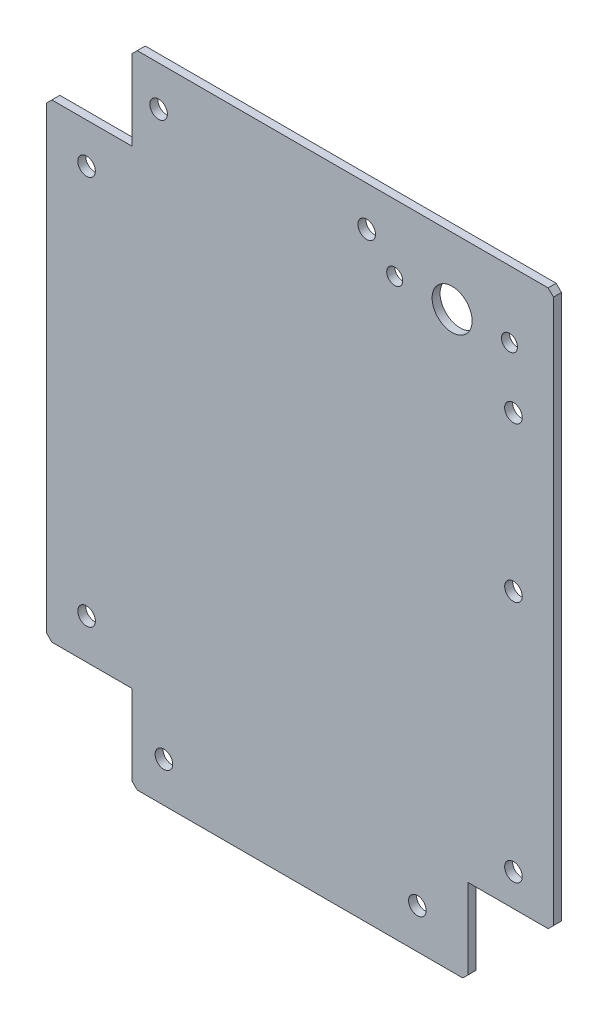
ISO-10303-21;
HEADER;
FILE_DESCRIPTION(('STEP AP214'),'2;1');
FILE_NAME('part.step','',(''),(''),'','','');
FILE_SCHEMA(('AUTOMOTIVE_DESIGN { 1 0 10303 214 1 1 1 1 }'));
ENDSEC;
DATA;
#1=APPLICATION_CONTEXT('core data for automotive mechanical design processes');
#2=APPLICATION_PROTOCOL_DEFINITION('international standard','automotive_design',2000,#1);
#3=PRODUCT_CONTEXT('',#1,'mechanical');
#4=PRODUCT('Part','Part','',(#3));
#5=PRODUCT_RELATED_PRODUCT_CATEGORY('part','',(#4));
#6=PRODUCT_DEFINITION_FORMATION('','',#4);
#7=PRODUCT_DEFINITION_CONTEXT('part definition',#1,'design');
#8=PRODUCT_DEFINITION('design','',#6,#7);
#9=PRODUCT_DEFINITION_SHAPE('','',#8);
#10=(LENGTH_UNIT() NAMED_UNIT(*) SI_UNIT(.MILLI.,.METRE.));
#11=(NAMED_UNIT(*) PLANE_ANGLE_UNIT() SI_UNIT($,.RADIAN.));
#12=(NAMED_UNIT(*) SI_UNIT($,.STERADIAN.) SOLID_ANGLE_UNIT());
#13=UNCERTAINTY_MEASURE_WITH_UNIT(LENGTH_MEASURE(1.E-05),#10,'distance_accuracy_value','');
#14=(GEOMETRIC_REPRESENTATION_CONTEXT(3) GLOBAL_UNCERTAINTY_ASSIGNED_CONTEXT((#13)) GLOBAL_UNIT_ASSIGNED_CONTEXT((#10,
#11,#12)) REPRESENTATION_CONTEXT('',''));
#15=CARTESIAN_POINT('',(0.,0.,0.));
#16=DIRECTION('',(0.,0.,1.));
#17=DIRECTION('',(1.,0.,0.));
#18=AXIS2_PLACEMENT_3D('',#15,#16,#17);
#19=CARTESIAN_POINT('',(190.,32.,-3.));
#20=DIRECTION('',(1.,0.,0.));
#21=DIRECTION('',(0.,0.,-1.));
#22=AXIS2_PLACEMENT_3D('',#19,#20,#21);
#23=PLANE('',#22);
#24=DIRECTION('',(0.,1.,0.));
#25=VECTOR('',#24,1.);
#26=CARTESIAN_POINT('',(190.,32.,0.));
#27=LINE('',#26,#25);
#28=CARTESIAN_POINT('',(190.,34.,0.));
#29=VERTEX_POINT('',#28);
#30=CARTESIAN_POINT('',(190.,238.,0.));
#31=VERTEX_POINT('',#30);
#32=EDGE_CURVE('E201',#29,#31,#27,.T.);
#33=ORIENTED_EDGE('',*,*,#32,.F.);
#34=DIRECTION('',(0.,0.,-1.));
#35=VECTOR('',#34,1.);
#36=CARTESIAN_POINT('',(190.,34.,-3.));
#37=LINE('',#36,#35);
#38=CARTESIAN_POINT('',(190.,34.,-3.));
#39=VERTEX_POINT('',#38);
#40=EDGE_CURVE('E11',#29,#39,#37,.T.);
#41=ORIENTED_EDGE('',*,*,#40,.T.);
#42=DIRECTION('',(0.,1.,0.));
#43=VECTOR('',#42,1.);
#44=CARTESIAN_POINT('',(190.,32.,-3.));
#45=LINE('',#44,#43);
#46=CARTESIAN_POINT('',(190.,238.,-3.));
#47=VERTEX_POINT('',#46);
#48=EDGE_CURVE('E227',#39,#47,#45,.T.);
#49=ORIENTED_EDGE('',*,*,#48,.T.);
#50=DIRECTION('',(0.,0.,1.));
#51=VECTOR('',#50,1.);
#52=CARTESIAN_POINT('',(190.,238.,-3.));
#53=LINE('',#52,#51);
#54=EDGE_CURVE('E46',#47,#31,#53,.T.);
#55=ORIENTED_EDGE('',*,*,#54,.T.);
#56=EDGE_LOOP('',(#33,#41,#49,#55));
#57=FACE_BOUND('',#56,.T.);
#58=ADVANCED_FACE('F38',(#57),#23,.T.);
#59=CARTESIAN_POINT('',(190.,32.,-3.));
#60=DIRECTION('',(0.,-1.,0.));
#61=DIRECTION('',(1.,0.,0.));
#62=AXIS2_PLACEMENT_3D('',#59,#60,#61);
#63=PLANE('',#62);
#64=DIRECTION('',(1.,0.,0.));
#65=VECTOR('',#64,1.);
#66=CARTESIAN_POINT('',(190.,32.,-3.));
#67=LINE('',#66,#65);
#68=CARTESIAN_POINT('',(158.,32.,-3.));
#69=VERTEX_POINT('',#68);
#70=CARTESIAN_POINT('',(188.,32.,-3.));
#71=VERTEX_POINT('',#70);
#72=EDGE_CURVE('E177',#69,#71,#67,.T.);
#73=ORIENTED_EDGE('',*,*,#72,.T.);
#74=DIRECTION('',(0.,0.,1.));
#75=VECTOR('',#74,1.);
#76=CARTESIAN_POINT('',(188.,32.,-3.));
#77=LINE('',#76,#75);
#78=CARTESIAN_POINT('',(188.,32.,0.));
#79=VERTEX_POINT('',#78);
#80=EDGE_CURVE('E283',#71,#79,#77,.T.);
#81=ORIENTED_EDGE('',*,*,#80,.T.);
#82=DIRECTION('',(1.,0.,0.));
#83=VECTOR('',#82,1.);
#84=CARTESIAN_POINT('',(190.,32.,0.));
#85=LINE('',#84,#83);
#86=CARTESIAN_POINT('',(158.,32.,0.));
#87=VERTEX_POINT('',#86);
#88=EDGE_CURVE('E224',#87,#79,#85,.T.);
#89=ORIENTED_EDGE('',*,*,#88,.F.);
#90=DIRECTION('',(0.,0.,1.));
#91=VECTOR('',#90,1.);
#92=CARTESIAN_POINT('',(158.,32.,-3.));
#93=LINE('',#92,#91);
#94=EDGE_CURVE('E228',#69,#87,#93,.T.);
#95=ORIENTED_EDGE('',*,*,#94,.F.);
#96=EDGE_LOOP('',(#73,#81,#89,#95));
#97=FACE_BOUND('',#96,.T.);
#98=ADVANCED_FACE('F302',(#97),#63,.T.);
#99=CARTESIAN_POINT('',(158.,32.,-3.));
#100=DIRECTION('',(1.,0.,0.));
#101=DIRECTION('',(0.,0.,-1.));
#102=AXIS2_PLACEMENT_3D('',#99,#100,#101);
#103=PLANE('',#102);
#104=DIRECTION('',(0.,1.,0.));
#105=VECTOR('',#104,1.);
#106=CARTESIAN_POINT('',(158.,32.,0.));
#107=LINE('',#106,#105);
#108=CARTESIAN_POINT('',(158.,2.00000000000003,0.));
#109=VERTEX_POINT('',#108);
#110=EDGE_CURVE('E222',#109,#87,#107,.T.);
#111=ORIENTED_EDGE('',*,*,#110,.F.);
#112=DIRECTION('',(0.,0.,-1.));
#113=VECTOR('',#112,1.);
#114=CARTESIAN_POINT('',(158.,2.00000000000003,-3.));
#115=LINE('',#114,#113);
#116=CARTESIAN_POINT('',(158.,2.00000000000003,-3.));
#117=VERTEX_POINT('',#116);
#118=EDGE_CURVE('E281',#109,#117,#115,.T.);
#119=ORIENTED_EDGE('',*,*,#118,.T.);
#120=DIRECTION('',(0.,1.,0.));
#121=VECTOR('',#120,1.);
#122=CARTESIAN_POINT('',(158.,32.,-3.));
#123=LINE('',#122,#121);
#124=EDGE_CURVE('E197',#117,#69,#123,.T.);
#125=ORIENTED_EDGE('',*,*,#124,.T.);
#126=ORIENTED_EDGE('',*,*,#94,.T.);
#127=EDGE_LOOP('',(#111,#119,#125,#126));
#128=FACE_BOUND('',#127,.T.);
#129=ADVANCED_FACE('F420',(#128),#103,.T.);
#130=CARTESIAN_POINT('',(32.,0.,-3.));
#131=DIRECTION('',(0.,-1.,0.));
#132=DIRECTION('',(0.,0.,-1.));
#133=AXIS2_PLACEMENT_3D('',#130,#131,#132);
#134=PLANE('',#133);
#135=DIRECTION('',(1.,0.,0.));
#136=VECTOR('',#135,1.);
#137=CARTESIAN_POINT('',(32.,0.,0.));
#138=LINE('',#137,#136);
#139=CARTESIAN_POINT('',(34.,0.,0.));
#140=VERTEX_POINT('',#139);
#141=CARTESIAN_POINT('',(156.,0.,0.));
#142=VERTEX_POINT('',#141);
#143=EDGE_CURVE('E219',#140,#142,#138,.T.);
#144=ORIENTED_EDGE('',*,*,#143,.F.);
#145=DIRECTION('',(0.,0.,-1.));
#146=VECTOR('',#145,1.);
#147=CARTESIAN_POINT('',(34.,0.,-3.));
#148=LINE('',#147,#146);
#149=CARTESIAN_POINT('',(34.,0.,-3.));
#150=VERTEX_POINT('',#149);
#151=EDGE_CURVE('E277',#140,#150,#148,.T.);
#152=ORIENTED_EDGE('',*,*,#151,.T.);
#153=DIRECTION('',(1.,0.,0.));
#154=VECTOR('',#153,1.);
#155=CARTESIAN_POINT('',(32.,0.,-3.));
#156=LINE('',#155,#154);
#157=CARTESIAN_POINT('',(156.,0.,-3.));
#158=VERTEX_POINT('',#157);
#159=EDGE_CURVE('E194',#150,#158,#156,.T.);
#160=ORIENTED_EDGE('',*,*,#159,.T.);
#161=DIRECTION('',(0.,0.,1.));
#162=VECTOR('',#161,1.);
#163=CARTESIAN_POINT('',(156.,0.,-3.));
#164=LINE('',#163,#162);
#165=EDGE_CURVE('E274',#158,#142,#164,.T.);
#166=ORIENTED_EDGE('',*,*,#165,.T.);
#167=EDGE_LOOP('',(#144,#152,#160,#166));
#168=FACE_BOUND('',#167,.T.);
#169=ADVANCED_FACE('F656',(#168),#134,.T.);
#170=CARTESIAN_POINT('',(32.,32.,-3.));
#171=DIRECTION('',(-1.,0.,0.));
#172=DIRECTION('',(0.,-1.,0.));
#173=AXIS2_PLACEMENT_3D('',#170,#171,#172);
#174=PLANE('',#173);
#175=DIRECTION('',(0.,-1.,0.));
#176=VECTOR('',#175,1.);
#177=CARTESIAN_POINT('',(32.,32.,-3.));
#178=LINE('',#177,#176);
#179=CARTESIAN_POINT('',(32.,32.,-3.));
#180=VERTEX_POINT('',#179);
#181=CARTESIAN_POINT('',(32.,1.99999999999997,-3.));
#182=VERTEX_POINT('',#181);
#183=EDGE_CURVE('E191',#180,#182,#178,.T.);
#184=ORIENTED_EDGE('',*,*,#183,.T.);
#185=DIRECTION('',(0.,0.,1.));
#186=VECTOR('',#185,1.);
#187=CARTESIAN_POINT('',(32.,1.99999999999997,-3.));
#188=LINE('',#187,#186);
#189=CARTESIAN_POINT('',(32.,1.99999999999997,0.));
#190=VERTEX_POINT('',#189);
#191=EDGE_CURVE('E271',#182,#190,#188,.T.);
#192=ORIENTED_EDGE('',*,*,#191,.T.);
#193=DIRECTION('',(0.,-1.,0.));
#194=VECTOR('',#193,1.);
#195=CARTESIAN_POINT('',(32.,32.,0.));
#196=LINE('',#195,#194);
#197=CARTESIAN_POINT('',(32.,32.,0.));
#198=VERTEX_POINT('',#197);
#199=EDGE_CURVE('E216',#198,#190,#196,.T.);
#200=ORIENTED_EDGE('',*,*,#199,.F.);
#201=DIRECTION('',(0.,0.,1.));
#202=VECTOR('',#201,1.);
#203=CARTESIAN_POINT('',(32.,32.,-3.));
#204=LINE('',#203,#202);
#205=EDGE_CURVE('E176',#180,#198,#204,.T.);
#206=ORIENTED_EDGE('',*,*,#205,.F.);
#207=EDGE_LOOP('',(#184,#192,#200,#206));
#208=FACE_BOUND('',#207,.T.);
#209=ADVANCED_FACE('F646',(#208),#174,.T.);
#210=CARTESIAN_POINT('',(0.,32.,-3.));
#211=DIRECTION('',(0.,-1.,0.));
#212=DIRECTION('',(0.,0.,-1.));
#213=AXIS2_PLACEMENT_3D('',#210,#211,#212);
#214=PLANE('',#213);
#215=DIRECTION('',(1.,0.,0.));
#216=VECTOR('',#215,1.);
#217=CARTESIAN_POINT('',(0.,32.,0.));
#218=LINE('',#217,#216);
#219=CARTESIAN_POINT('',(2.,32.,0.));
#220=VERTEX_POINT('',#219);
#221=EDGE_CURVE('E214',#220,#198,#218,.T.);
#222=ORIENTED_EDGE('',*,*,#221,.F.);
#223=DIRECTION('',(0.,0.,-1.));
#224=VECTOR('',#223,1.);
#225=CARTESIAN_POINT('',(2.,32.,-3.));
#226=LINE('',#225,#224);
#227=CARTESIAN_POINT('',(2.,32.,-3.));
#228=VERTEX_POINT('',#227);
#229=EDGE_CURVE('E279',#220,#228,#226,.T.);
#230=ORIENTED_EDGE('',*,*,#229,.T.);
#231=DIRECTION('',(1.,0.,0.));
#232=VECTOR('',#231,1.);
#233=CARTESIAN_POINT('',(0.,32.,-3.));
#234=LINE('',#233,#232);
#235=EDGE_CURVE('E186',#228,#180,#234,.T.);
#236=ORIENTED_EDGE('',*,*,#235,.T.);
#237=ORIENTED_EDGE('',*,*,#205,.T.);
#238=EDGE_LOOP('',(#222,#230,#236,#237));
#239=FACE_BOUND('',#238,.T.);
#240=ADVANCED_FACE('F636',(#239),#214,.T.);
#241=CARTESIAN_POINT('',(0.,32.,-3.));
#242=DIRECTION('',(-1.,0.,0.));
#243=DIRECTION('',(0.,0.,1.));
#244=AXIS2_PLACEMENT_3D('',#241,#242,#243);
#245=PLANE('',#244);
#246=DIRECTION('',(0.,-1.,0.));
#247=VECTOR('',#246,1.);
#248=CARTESIAN_POINT('',(0.,32.,0.));
#249=LINE('',#248,#247);
#250=CARTESIAN_POINT('',(0.,206.,0.));
#251=VERTEX_POINT('',#250);
#252=CARTESIAN_POINT('',(0.,34.,0.));
#253=VERTEX_POINT('',#252);
#254=EDGE_CURVE('E211',#251,#253,#249,.T.);
#255=ORIENTED_EDGE('',*,*,#254,.F.);
#256=DIRECTION('',(0.,0.,-1.));
#257=VECTOR('',#256,1.);
#258=CARTESIAN_POINT('',(0.,206.,-3.));
#259=LINE('',#258,#257);
#260=CARTESIAN_POINT('',(0.,206.,-3.));
#261=VERTEX_POINT('',#260);
#262=EDGE_CURVE('E252',#251,#261,#259,.T.);
#263=ORIENTED_EDGE('',*,*,#262,.T.);
#264=DIRECTION('',(0.,-1.,0.));
#265=VECTOR('',#264,1.);
#266=CARTESIAN_POINT('',(0.,32.,-3.));
#267=LINE('',#266,#265);
#268=CARTESIAN_POINT('',(0.,34.,-3.));
#269=VERTEX_POINT('',#268);
#270=EDGE_CURVE('E183',#261,#269,#267,.T.);
#271=ORIENTED_EDGE('',*,*,#270,.T.);
#272=DIRECTION('',(0.,0.,1.));
#273=VECTOR('',#272,1.);
#274=CARTESIAN_POINT('',(0.,34.,-3.));
#275=LINE('',#274,#273);
#276=EDGE_CURVE('E249',#269,#253,#275,.T.);
#277=ORIENTED_EDGE('',*,*,#276,.T.);
#278=EDGE_LOOP('',(#255,#263,#271,#277));
#279=FACE_BOUND('',#278,.T.);
#280=ADVANCED_FACE('F627',(#279),#245,.T.);
#281=CARTESIAN_POINT('',(0.,208.,-3.));
#282=DIRECTION('',(0.,1.,0.));
#283=DIRECTION('',(-1.,0.,0.));
#284=AXIS2_PLACEMENT_3D('',#281,#282,#283);
#285=PLANE('',#284);
#286=DIRECTION('',(-1.,0.,0.));
#287=VECTOR('',#286,1.);
#288=CARTESIAN_POINT('',(0.,208.,-3.));
#289=LINE('',#288,#287);
#290=CARTESIAN_POINT('',(32.,208.,-3.));
#291=VERTEX_POINT('',#290);
#292=CARTESIAN_POINT('',(1.99999999999997,208.,-3.));
#293=VERTEX_POINT('',#292);
#294=EDGE_CURVE('E166',#291,#293,#289,.T.);
#295=ORIENTED_EDGE('',*,*,#294,.T.);
#296=DIRECTION('',(0.,0.,1.));
#297=VECTOR('',#296,1.);
#298=CARTESIAN_POINT('',(1.99999999999997,208.,-3.));
#299=LINE('',#298,#297);
#300=CARTESIAN_POINT('',(1.99999999999997,208.,0.));
#301=VERTEX_POINT('',#300);
#302=EDGE_CURVE('E231',#293,#301,#299,.T.);
#303=ORIENTED_EDGE('',*,*,#302,.T.);
#304=DIRECTION('',(-1.,0.,0.));
#305=VECTOR('',#304,1.);
#306=CARTESIAN_POINT('',(0.,208.,0.));
#307=LINE('',#306,#305);
#308=CARTESIAN_POINT('',(32.,208.,0.));
#309=VERTEX_POINT('',#308);
#310=EDGE_CURVE('E175',#309,#301,#307,.T.);
#311=ORIENTED_EDGE('',*,*,#310,.F.);
#312=DIRECTION('',(0.,0.,1.));
#313=VECTOR('',#312,1.);
#314=CARTESIAN_POINT('',(32.,208.,-3.));
#315=LINE('',#314,#313);
#316=EDGE_CURVE('E161',#291,#309,#315,.T.);
#317=ORIENTED_EDGE('',*,*,#316,.F.);
#318=EDGE_LOOP('',(#295,#303,#311,#317));
#319=FACE_BOUND('',#318,.T.);
#320=ADVANCED_FACE('F171',(#319),#285,.T.);
#321=CARTESIAN_POINT('',(32.,208.,-3.));
#322=DIRECTION('',(-1.,0.,0.));
#323=DIRECTION('',(0.,0.,1.));
#324=AXIS2_PLACEMENT_3D('',#321,#322,#323);
#325=PLANE('',#324);
#326=DIRECTION('',(0.,-1.,0.));
#327=VECTOR('',#326,1.);
#328=CARTESIAN_POINT('',(32.,208.,0.));
#329=LINE('',#328,#327);
#330=CARTESIAN_POINT('',(32.,238.,0.));
#331=VERTEX_POINT('',#330);
#332=EDGE_CURVE('E208',#331,#309,#329,.T.);
#333=ORIENTED_EDGE('',*,*,#332,.F.);
#334=DIRECTION('',(0.,0.,-1.));
#335=VECTOR('',#334,1.);
#336=CARTESIAN_POINT('',(32.,238.,-3.));
#337=LINE('',#336,#335);
#338=CARTESIAN_POINT('',(32.,238.,-3.));
#339=VERTEX_POINT('',#338);
#340=EDGE_CURVE('E164',#331,#339,#337,.T.);
#341=ORIENTED_EDGE('',*,*,#340,.T.);
#342=DIRECTION('',(0.,-1.,0.));
#343=VECTOR('',#342,1.);
#344=CARTESIAN_POINT('',(32.,208.,-3.));
#345=LINE('',#344,#343);
#346=EDGE_CURVE('E157',#339,#291,#345,.T.);
#347=ORIENTED_EDGE('',*,*,#346,.T.);
#348=ORIENTED_EDGE('',*,*,#316,.T.);
#349=EDGE_LOOP('',(#333,#341,#347,#348));
#350=FACE_BOUND('',#349,.T.);
#351=ADVANCED_FACE('F160',(#350),#325,.T.);
#352=CARTESIAN_POINT('',(32.,240.,-3.));
#353=DIRECTION('',(0.,1.,0.));
#354=DIRECTION('',(0.,0.,1.));
#355=AXIS2_PLACEMENT_3D('',#352,#353,#354);
#356=PLANE('',#355);
#357=DIRECTION('',(-1.,0.,0.));
#358=VECTOR('',#357,1.);
#359=CARTESIAN_POINT('',(32.,240.,-3.));
#360=LINE('',#359,#358);
#361=CARTESIAN_POINT('',(188.,240.,-3.));
#362=VERTEX_POINT('',#361);
#363=CARTESIAN_POINT('',(34.,240.,-3.));
#364=VERTEX_POINT('',#363);
#365=EDGE_CURVE('E167',#362,#364,#360,.T.);
#366=ORIENTED_EDGE('',*,*,#365,.T.);
#367=DIRECTION('',(0.,0.,1.));
#368=VECTOR('',#367,1.);
#369=CARTESIAN_POINT('',(34.,240.,-3.));
#370=LINE('',#369,#368);
#371=CARTESIAN_POINT('',(34.,240.,0.));
#372=VERTEX_POINT('',#371);
#373=EDGE_CURVE('E267',#364,#372,#370,.T.);
#374=ORIENTED_EDGE('',*,*,#373,.T.);
#375=DIRECTION('',(-1.,0.,0.));
#376=VECTOR('',#375,1.);
#377=CARTESIAN_POINT('',(32.,240.,0.));
#378=LINE('',#377,#376);
#379=CARTESIAN_POINT('',(188.,240.,0.));
#380=VERTEX_POINT('',#379);
#381=EDGE_CURVE('E204',#380,#372,#378,.T.);
#382=ORIENTED_EDGE('',*,*,#381,.F.);
#383=DIRECTION('',(0.,0.,-1.));
#384=VECTOR('',#383,1.);
#385=CARTESIAN_POINT('',(188.,240.,-3.));
#386=LINE('',#385,#384);
#387=EDGE_CURVE('E60',#380,#362,#386,.T.);
#388=ORIENTED_EDGE('',*,*,#387,.T.);
#389=EDGE_LOOP('',(#366,#374,#382,#388));
#390=FACE_BOUND('',#389,.T.);
#391=ADVANCED_FACE('F424',(#390),#356,.T.);
#392=CARTESIAN_POINT('',(0.,0.,-3.));
#393=DIRECTION('',(0.,0.,-1.));
#394=DIRECTION('',(-1.,0.,0.));
#395=AXIS2_PLACEMENT_3D('',#392,#393,#394);
#396=PLANE('',#395);
#397=CARTESIAN_POINT('',(15.,193.,-3.));
#398=DIRECTION('',(0.,0.,-1.));
#399=DIRECTION('',(-1.,0.,0.));
#400=AXIS2_PLACEMENT_3D('',#397,#398,#399);
#401=CIRCLE('',#400,3.3);
#402=CARTESIAN_POINT('',(11.7,193.,-3.));
#403=VERTEX_POINT('',#402);
#404=EDGE_CURVE('E326',#403,#403,#401,.T.);
#405=ORIENTED_EDGE('',*,*,#404,.F.);
#406=EDGE_LOOP('',(#405));
#407=FACE_BOUND('',#406,.T.);
#408=CARTESIAN_POINT('',(15.,47.,-3.));
#409=DIRECTION('',(0.,0.,-1.));
#410=DIRECTION('',(-1.,0.,0.));
#411=AXIS2_PLACEMENT_3D('',#408,#409,#410);
#412=CIRCLE('',#411,3.3);
#413=CARTESIAN_POINT('',(11.7,47.,-3.));
#414=VERTEX_POINT('',#413);
#415=EDGE_CURVE('E329',#414,#414,#412,.T.);
#416=ORIENTED_EDGE('',*,*,#415,.F.);
#417=EDGE_LOOP('',(#416));
#418=FACE_BOUND('',#417,.T.);
#419=CARTESIAN_POINT('',(152.,215.,-3.));
#420=DIRECTION('',(0.,0.,-1.));
#421=DIRECTION('',(-1.,0.,0.));
#422=AXIS2_PLACEMENT_3D('',#419,#420,#421);
#423=CIRCLE('',#422,7.50000000000001);
#424=CARTESIAN_POINT('',(144.5,215.,-3.));
#425=VERTEX_POINT('',#424);
#426=EDGE_CURVE('E332',#425,#425,#423,.T.);
#427=ORIENTED_EDGE('',*,*,#426,.F.);
#428=EDGE_LOOP('',(#427));
#429=FACE_BOUND('',#428,.T.);
#430=CARTESIAN_POINT('',(44.,15.,-3.));
#431=DIRECTION('',(0.,0.,-1.));
#432=DIRECTION('',(-1.,0.,0.));
#433=AXIS2_PLACEMENT_3D('',#430,#431,#432);
#434=CIRCLE('',#433,3.3);
#435=CARTESIAN_POINT('',(40.7,15.,-3.));
#436=VERTEX_POINT('',#435);
#437=EDGE_CURVE('E335',#436,#436,#434,.T.);
#438=ORIENTED_EDGE('',*,*,#437,.F.);
#439=EDGE_LOOP('',(#438));
#440=FACE_BOUND('',#439,.T.);
#441=CARTESIAN_POINT('',(139.,15.,-3.));
#442=DIRECTION('',(0.,0.,-1.));
#443=DIRECTION('',(-1.,0.,0.));
#444=AXIS2_PLACEMENT_3D('',#441,#442,#443);
#445=CIRCLE('',#444,3.3);
#446=CARTESIAN_POINT('',(135.7,15.,-3.));
#447=VERTEX_POINT('',#446);
#448=EDGE_CURVE('E338',#447,#447,#445,.T.);
#449=ORIENTED_EDGE('',*,*,#448,.F.);
#450=EDGE_LOOP('',(#449));
#451=FACE_BOUND('',#450,.T.);
#452=CARTESIAN_POINT('',(175.,44.,-3.));
#453=DIRECTION('',(0.,0.,-1.));
#454=DIRECTION('',(-1.,0.,0.));
#455=AXIS2_PLACEMENT_3D('',#452,#453,#454);
#456=CIRCLE('',#455,3.3);
#457=CARTESIAN_POINT('',(171.7,44.,-3.));
#458=VERTEX_POINT('',#457);
#459=EDGE_CURVE('E341',#458,#458,#456,.T.);
#460=ORIENTED_EDGE('',*,*,#459,.F.);
#461=EDGE_LOOP('',(#460));
#462=FACE_BOUND('',#461,.T.);
#463=CARTESIAN_POINT('',(175.,135.,-3.));
#464=DIRECTION('',(0.,0.,-1.));
#465=DIRECTION('',(-1.,0.,0.));
#466=AXIS2_PLACEMENT_3D('',#463,#464,#465);
#467=CIRCLE('',#466,3.3);
#468=CARTESIAN_POINT('',(171.7,135.,-3.));
#469=VERTEX_POINT('',#468);
#470=EDGE_CURVE('E344',#469,#469,#467,.T.);
#471=ORIENTED_EDGE('',*,*,#470,.F.);
#472=EDGE_LOOP('',(#471));
#473=FACE_BOUND('',#472,.T.);
#474=CARTESIAN_POINT('',(175.,193.,-3.));
#475=DIRECTION('',(0.,0.,-1.));
#476=DIRECTION('',(-1.,0.,0.));
#477=AXIS2_PLACEMENT_3D('',#474,#475,#476);
#478=CIRCLE('',#477,3.3);
#479=CARTESIAN_POINT('',(171.7,193.,-3.));
#480=VERTEX_POINT('',#479);
#481=EDGE_CURVE('E347',#480,#480,#478,.T.);
#482=ORIENTED_EDGE('',*,*,#481,.F.);
#483=EDGE_LOOP('',(#482));
#484=FACE_BOUND('',#483,.T.);
#485=CARTESIAN_POINT('',(120.,225.,-3.));
#486=DIRECTION('',(0.,0.,-1.));
#487=DIRECTION('',(-1.,0.,0.));
#488=AXIS2_PLACEMENT_3D('',#485,#486,#487);
#489=CIRCLE('',#488,3.3);
#490=CARTESIAN_POINT('',(116.7,225.,-3.));
#491=VERTEX_POINT('',#490);
#492=EDGE_CURVE('E350',#491,#491,#489,.T.);
#493=ORIENTED_EDGE('',*,*,#492,.F.);
#494=EDGE_LOOP('',(#493));
#495=FACE_BOUND('',#494,.T.);
#496=CARTESIAN_POINT('',(42.,225.,-3.));
#497=DIRECTION('',(0.,0.,-1.));
#498=DIRECTION('',(-1.,0.,0.));
#499=AXIS2_PLACEMENT_3D('',#496,#497,#498);
#500=CIRCLE('',#499,3.3);
#501=CARTESIAN_POINT('',(38.7,225.,-3.));
#502=VERTEX_POINT('',#501);
#503=EDGE_CURVE('E320',#502,#502,#500,.T.);
#504=ORIENTED_EDGE('',*,*,#503,.F.);
#505=EDGE_LOOP('',(#504));
#506=FACE_BOUND('',#505,.T.);
#507=CARTESIAN_POINT('',(173.5,215.,-3.));
#508=DIRECTION('',(0.,0.,-1.));
#509=DIRECTION('',(-1.,0.,0.));
#510=AXIS2_PLACEMENT_3D('',#507,#508,#509);
#511=CIRCLE('',#510,2.99999999999999);
#512=CARTESIAN_POINT('',(170.5,215.,-3.));
#513=VERTEX_POINT('',#512);
#514=EDGE_CURVE('E314',#513,#513,#511,.T.);
#515=ORIENTED_EDGE('',*,*,#514,.F.);
#516=EDGE_LOOP('',(#515));
#517=FACE_BOUND('',#516,.T.);
#518=CARTESIAN_POINT('',(130.5,215.,-3.));
#519=DIRECTION('',(0.,0.,-1.));
#520=DIRECTION('',(-1.,0.,0.));
#521=AXIS2_PLACEMENT_3D('',#518,#519,#520);
#522=CIRCLE('',#521,2.99999999999999);
#523=CARTESIAN_POINT('',(127.5,215.,-3.));
#524=VERTEX_POINT('',#523);
#525=EDGE_CURVE('E205',#524,#524,#522,.T.);
#526=ORIENTED_EDGE('',*,*,#525,.F.);
#527=EDGE_LOOP('',(#526));
#528=FACE_BOUND('',#527,.T.);
#529=ORIENTED_EDGE('',*,*,#270,.F.);
#530=DIRECTION('',(-0.707106781186543,-0.707106781186552,0.));
#531=VECTOR('',#530,1.);
#532=CARTESIAN_POINT('',(-103.,102.999999999999,-3.));
#533=LINE('',#532,#531);
#534=EDGE_CURVE('E182',#261,#293,#533,.F.);
#535=ORIENTED_EDGE('',*,*,#534,.T.);
#536=ORIENTED_EDGE('',*,*,#294,.F.);
#537=ORIENTED_EDGE('',*,*,#346,.F.);
#538=DIRECTION('',(-0.707106781186543,-0.707106781186552,0.));
#539=VECTOR('',#538,1.);
#540=CARTESIAN_POINT('',(-103.,102.999999999998,-3.));
#541=LINE('',#540,#539);
#542=EDGE_CURVE('E53',#339,#364,#541,.F.);
#543=ORIENTED_EDGE('',*,*,#542,.T.);
#544=ORIENTED_EDGE('',*,*,#365,.F.);
#545=DIRECTION('',(-0.707106781186543,0.707106781186552,0.));
#546=VECTOR('',#545,1.);
#547=CARTESIAN_POINT('',(214.000000000001,213.999999999998,-3.));
#548=LINE('',#547,#546);
#549=EDGE_CURVE('E254',#362,#47,#548,.F.);
#550=ORIENTED_EDGE('',*,*,#549,.T.);
#551=ORIENTED_EDGE('',*,*,#48,.F.);
#552=DIRECTION('',(0.707106781186548,0.707106781186548,0.));
#553=VECTOR('',#552,1.);
#554=CARTESIAN_POINT('',(78.,-78.,-3.));
#555=LINE('',#554,#553);
#556=EDGE_CURVE('E256',#39,#71,#555,.F.);
#557=ORIENTED_EDGE('',*,*,#556,.T.);
#558=ORIENTED_EDGE('',*,*,#72,.F.);
#559=ORIENTED_EDGE('',*,*,#124,.F.);
#560=DIRECTION('',(0.707106781186552,0.707106781186543,0.));
#561=VECTOR('',#560,1.);
#562=CARTESIAN_POINT('',(77.9999999999989,-78.,-3.));
#563=LINE('',#562,#561);
#564=EDGE_CURVE('E258',#117,#158,#563,.F.);
#565=ORIENTED_EDGE('',*,*,#564,.T.);
#566=ORIENTED_EDGE('',*,*,#159,.F.);
#567=DIRECTION('',(0.707106781186552,-0.707106781186543,0.));
#568=VECTOR('',#567,1.);
#569=CARTESIAN_POINT('',(16.9999999999998,17.,-3.));
#570=LINE('',#569,#568);
#571=EDGE_CURVE('E262',#150,#182,#570,.F.);
#572=ORIENTED_EDGE('',*,*,#571,.T.);
#573=ORIENTED_EDGE('',*,*,#183,.F.);
#574=ORIENTED_EDGE('',*,*,#235,.F.);
#575=DIRECTION('',(0.707106781186552,-0.707106781186543,0.));
#576=VECTOR('',#575,1.);
#577=CARTESIAN_POINT('',(17.,17.0000000000002,-3.));
#578=LINE('',#577,#576);
#579=EDGE_CURVE('E260',#228,#269,#578,.F.);
#580=ORIENTED_EDGE('',*,*,#579,.T.);
#581=EDGE_LOOP('',(#529,#535,#536,#537,#543,#544,#550,#551,#557,#558,#559,#565,#566,#572,#573,
#574,#580));
#582=FACE_BOUND('',#581,.T.);
#583=ADVANCED_FACE('F180',(#407,#418,#429,#440,#451,#462,#473,#484,#495,#506,#517,#528,#582),
#396,.T.);
#584=CARTESIAN_POINT('',(0.,0.,0.));
#585=DIRECTION('',(0.,0.,-1.));
#586=DIRECTION('',(-1.,0.,0.));
#587=AXIS2_PLACEMENT_3D('',#584,#585,#586);
#588=PLANE('',#587);
#589=CARTESIAN_POINT('',(15.,193.,0.));
#590=DIRECTION('',(0.,0.,1.));
#591=DIRECTION('',(1.,0.,0.));
#592=AXIS2_PLACEMENT_3D('',#589,#590,#591);
#593=CIRCLE('',#592,3.3);
#594=CARTESIAN_POINT('',(18.3,193.,0.));
#595=VERTEX_POINT('',#594);
#596=EDGE_CURVE('E366',#595,#595,#593,.T.);
#597=ORIENTED_EDGE('',*,*,#596,.F.);
#598=EDGE_LOOP('',(#597));
#599=FACE_BOUND('',#598,.T.);
#600=CARTESIAN_POINT('',(15.,47.,0.));
#601=DIRECTION('',(0.,0.,1.));
#602=DIRECTION('',(1.,0.,0.));
#603=AXIS2_PLACEMENT_3D('',#600,#601,#602);
#604=CIRCLE('',#603,3.3);
#605=CARTESIAN_POINT('',(18.3,47.,0.));
#606=VERTEX_POINT('',#605);
#607=EDGE_CURVE('E370',#606,#606,#604,.T.);
#608=ORIENTED_EDGE('',*,*,#607,.F.);
#609=EDGE_LOOP('',(#608));
#610=FACE_BOUND('',#609,.T.);
#611=CARTESIAN_POINT('',(152.,215.,0.));
#612=DIRECTION('',(0.,0.,1.));
#613=DIRECTION('',(1.,0.,0.));
#614=AXIS2_PLACEMENT_3D('',#611,#612,#613);
#615=CIRCLE('',#614,7.50000000000001);
#616=CARTESIAN_POINT('',(159.5,215.,0.));
#617=VERTEX_POINT('',#616);
#618=EDGE_CURVE('E371',#617,#617,#615,.T.);
#619=ORIENTED_EDGE('',*,*,#618,.F.);
#620=EDGE_LOOP('',(#619));
#621=FACE_BOUND('',#620,.T.);
#622=CARTESIAN_POINT('',(44.,15.,0.));
#623=DIRECTION('',(0.,0.,1.));
#624=DIRECTION('',(1.,0.,0.));
#625=AXIS2_PLACEMENT_3D('',#622,#623,#624);
#626=CIRCLE('',#625,3.3);
#627=CARTESIAN_POINT('',(47.3,15.,0.));
#628=VERTEX_POINT('',#627);
#629=EDGE_CURVE('E369',#628,#628,#626,.T.);
#630=ORIENTED_EDGE('',*,*,#629,.F.);
#631=EDGE_LOOP('',(#630));
#632=FACE_BOUND('',#631,.T.);
#633=CARTESIAN_POINT('',(139.,15.,0.));
#634=DIRECTION('',(0.,0.,1.));
#635=DIRECTION('',(1.,0.,0.));
#636=AXIS2_PLACEMENT_3D('',#633,#634,#635);
#637=CIRCLE('',#636,3.3);
#638=CARTESIAN_POINT('',(142.3,15.,0.));
#639=VERTEX_POINT('',#638);
#640=EDGE_CURVE('E358',#639,#639,#637,.T.);
#641=ORIENTED_EDGE('',*,*,#640,.F.);
#642=EDGE_LOOP('',(#641));
#643=FACE_BOUND('',#642,.T.);
#644=CARTESIAN_POINT('',(175.,44.,0.));
#645=DIRECTION('',(0.,0.,1.));
#646=DIRECTION('',(1.,0.,0.));
#647=AXIS2_PLACEMENT_3D('',#644,#645,#646);
#648=CIRCLE('',#647,3.3);
#649=CARTESIAN_POINT('',(178.3,44.,0.));
#650=VERTEX_POINT('',#649);
#651=EDGE_CURVE('E354',#650,#650,#648,.T.);
#652=ORIENTED_EDGE('',*,*,#651,.F.);
#653=EDGE_LOOP('',(#652));
#654=FACE_BOUND('',#653,.T.);
#655=CARTESIAN_POINT('',(175.,135.,0.));
#656=DIRECTION('',(0.,0.,1.));
#657=DIRECTION('',(1.,0.,0.));
#658=AXIS2_PLACEMENT_3D('',#655,#656,#657);
#659=CIRCLE('',#658,3.3);
#660=CARTESIAN_POINT('',(178.3,135.,0.));
#661=VERTEX_POINT('',#660);
#662=EDGE_CURVE('E357',#661,#661,#659,.T.);
#663=ORIENTED_EDGE('',*,*,#662,.F.);
#664=EDGE_LOOP('',(#663));
#665=FACE_BOUND('',#664,.T.);
#666=CARTESIAN_POINT('',(175.,193.,0.));
#667=DIRECTION('',(0.,0.,1.));
#668=DIRECTION('',(1.,0.,0.));
#669=AXIS2_PLACEMENT_3D('',#666,#667,#668);
#670=CIRCLE('',#669,3.3);
#671=CARTESIAN_POINT('',(178.3,193.,0.));
#672=VERTEX_POINT('',#671);
#673=EDGE_CURVE('E361',#672,#672,#670,.T.);
#674=ORIENTED_EDGE('',*,*,#673,.F.);
#675=EDGE_LOOP('',(#674));
#676=FACE_BOUND('',#675,.T.);
#677=CARTESIAN_POINT('',(120.,225.,0.));
#678=DIRECTION('',(0.,0.,1.));
#679=DIRECTION('',(1.,0.,0.));
#680=AXIS2_PLACEMENT_3D('',#677,#678,#679);
#681=CIRCLE('',#680,3.3);
#682=CARTESIAN_POINT('',(123.3,225.,0.));
#683=VERTEX_POINT('',#682);
#684=EDGE_CURVE('E353',#683,#683,#681,.T.);
#685=ORIENTED_EDGE('',*,*,#684,.F.);
#686=EDGE_LOOP('',(#685));
#687=FACE_BOUND('',#686,.T.);
#688=CARTESIAN_POINT('',(42.,225.,0.));
#689=DIRECTION('',(0.,0.,1.));
#690=DIRECTION('',(1.,0.,0.));
#691=AXIS2_PLACEMENT_3D('',#688,#689,#690);
#692=CIRCLE('',#691,3.3);
#693=CARTESIAN_POINT('',(45.3,225.,0.));
#694=VERTEX_POINT('',#693);
#695=EDGE_CURVE('E323',#694,#694,#692,.T.);
#696=ORIENTED_EDGE('',*,*,#695,.F.);
#697=EDGE_LOOP('',(#696));
#698=FACE_BOUND('',#697,.T.);
#699=CARTESIAN_POINT('',(173.5,215.,0.));
#700=DIRECTION('',(0.,0.,1.));
#701=DIRECTION('',(1.,0.,0.));
#702=AXIS2_PLACEMENT_3D('',#699,#700,#701);
#703=CIRCLE('',#702,2.99999999999999);
#704=CARTESIAN_POINT('',(176.5,215.,0.));
#705=VERTEX_POINT('',#704);
#706=EDGE_CURVE('E317',#705,#705,#703,.T.);
#707=ORIENTED_EDGE('',*,*,#706,.F.);
#708=EDGE_LOOP('',(#707));
#709=FACE_BOUND('',#708,.T.);
#710=CARTESIAN_POINT('',(130.5,215.,0.));
#711=DIRECTION('',(0.,0.,1.));
#712=DIRECTION('',(1.,0.,0.));
#713=AXIS2_PLACEMENT_3D('',#710,#711,#712);
#714=CIRCLE('',#713,2.99999999999999);
#715=CARTESIAN_POINT('',(133.5,215.,0.));
#716=VERTEX_POINT('',#715);
#717=EDGE_CURVE('E311',#716,#716,#714,.T.);
#718=ORIENTED_EDGE('',*,*,#717,.F.);
#719=EDGE_LOOP('',(#718));
#720=FACE_BOUND('',#719,.T.);
#721=ORIENTED_EDGE('',*,*,#310,.T.);
#722=DIRECTION('',(0.707106781186543,0.707106781186552,0.));
#723=VECTOR('',#722,1.);
#724=CARTESIAN_POINT('',(1.99999999999997,208.,0.));
#725=LINE('',#724,#723);
#726=EDGE_CURVE('E247',#301,#251,#725,.F.);
#727=ORIENTED_EDGE('',*,*,#726,.T.);
#728=ORIENTED_EDGE('',*,*,#254,.T.);
#729=DIRECTION('',(-0.707106781186552,0.707106781186543,0.));
#730=VECTOR('',#729,1.);
#731=CARTESIAN_POINT('',(0.,34.,0.));
#732=LINE('',#731,#730);
#733=EDGE_CURVE('E241',#253,#220,#732,.F.);
#734=ORIENTED_EDGE('',*,*,#733,.T.);
#735=ORIENTED_EDGE('',*,*,#221,.T.);
#736=ORIENTED_EDGE('',*,*,#199,.T.);
#737=DIRECTION('',(-0.707106781186552,0.707106781186543,0.));
#738=VECTOR('',#737,1.);
#739=CARTESIAN_POINT('',(32.,1.99999999999997,0.));
#740=LINE('',#739,#738);
#741=EDGE_CURVE('E243',#190,#140,#740,.F.);
#742=ORIENTED_EDGE('',*,*,#741,.T.);
#743=ORIENTED_EDGE('',*,*,#143,.T.);
#744=DIRECTION('',(-0.707106781186552,-0.707106781186543,0.));
#745=VECTOR('',#744,1.);
#746=CARTESIAN_POINT('',(156.,0.,0.));
#747=LINE('',#746,#745);
#748=EDGE_CURVE('E239',#142,#109,#747,.F.);
#749=ORIENTED_EDGE('',*,*,#748,.T.);
#750=ORIENTED_EDGE('',*,*,#110,.T.);
#751=ORIENTED_EDGE('',*,*,#88,.T.);
#752=DIRECTION('',(-0.707106781186548,-0.707106781186548,0.));
#753=VECTOR('',#752,1.);
#754=CARTESIAN_POINT('',(188.,32.,0.));
#755=LINE('',#754,#753);
#756=EDGE_CURVE('E237',#79,#29,#755,.F.);
#757=ORIENTED_EDGE('',*,*,#756,.T.);
#758=ORIENTED_EDGE('',*,*,#32,.T.);
#759=DIRECTION('',(0.707106781186543,-0.707106781186552,0.));
#760=VECTOR('',#759,1.);
#761=CARTESIAN_POINT('',(190.,238.,0.));
#762=LINE('',#761,#760);
#763=EDGE_CURVE('E235',#31,#380,#762,.F.);
#764=ORIENTED_EDGE('',*,*,#763,.T.);
#765=ORIENTED_EDGE('',*,*,#381,.T.);
#766=DIRECTION('',(0.707106781186543,0.707106781186552,0.));
#767=VECTOR('',#766,1.);
#768=CARTESIAN_POINT('',(34.,240.,0.));
#769=LINE('',#768,#767);
#770=EDGE_CURVE('E245',#372,#331,#769,.F.);
#771=ORIENTED_EDGE('',*,*,#770,.T.);
#772=ORIENTED_EDGE('',*,*,#332,.T.);
#773=EDGE_LOOP('',(#721,#727,#728,#734,#735,#736,#742,#743,#749,#750,#751,#757,#758,#764,#765,
#771,#772));
#774=FACE_BOUND('',#773,.T.);
#775=ADVANCED_FACE('F295',(#599,#610,#621,#632,#643,#654,#665,#676,#687,#698,#709,#720,#774),
#588,.F.);
#776=CARTESIAN_POINT('',(1.99999999999997,208.,-3.));
#777=DIRECTION('',(0.707106781186552,-0.707106781186543,0.));
#778=DIRECTION('',(0.,0.,1.));
#779=AXIS2_PLACEMENT_3D('',#776,#777,#778);
#780=PLANE('',#779);
#781=ORIENTED_EDGE('',*,*,#534,.F.);
#782=ORIENTED_EDGE('',*,*,#262,.F.);
#783=ORIENTED_EDGE('',*,*,#726,.F.);
#784=ORIENTED_EDGE('',*,*,#302,.F.);
#785=EDGE_LOOP('',(#781,#782,#783,#784));
#786=FACE_BOUND('',#785,.T.);
#787=ADVANCED_FACE('F385',(#786),#780,.F.);
#788=CARTESIAN_POINT('',(34.,240.,-3.));
#789=DIRECTION('',(0.707106781186552,-0.707106781186543,0.));
#790=DIRECTION('',(0.,0.,1.));
#791=AXIS2_PLACEMENT_3D('',#788,#789,#790);
#792=PLANE('',#791);
#793=ORIENTED_EDGE('',*,*,#542,.F.);
#794=ORIENTED_EDGE('',*,*,#340,.F.);
#795=ORIENTED_EDGE('',*,*,#770,.F.);
#796=ORIENTED_EDGE('',*,*,#373,.F.);
#797=EDGE_LOOP('',(#793,#794,#795,#796));
#798=FACE_BOUND('',#797,.T.);
#799=ADVANCED_FACE('F428',(#798),#792,.F.);
#800=CARTESIAN_POINT('',(32.,1.99999999999997,-3.));
#801=DIRECTION('',(0.707106781186543,0.707106781186552,0.));
#802=DIRECTION('',(0.,0.,1.));
#803=AXIS2_PLACEMENT_3D('',#800,#801,#802);
#804=PLANE('',#803);
#805=ORIENTED_EDGE('',*,*,#571,.F.);
#806=ORIENTED_EDGE('',*,*,#151,.F.);
#807=ORIENTED_EDGE('',*,*,#741,.F.);
#808=ORIENTED_EDGE('',*,*,#191,.F.);
#809=EDGE_LOOP('',(#805,#806,#807,#808));
#810=FACE_BOUND('',#809,.T.);
#811=ADVANCED_FACE('F432',(#810),#804,.F.);
#812=CARTESIAN_POINT('',(0.,34.,-3.));
#813=DIRECTION('',(0.707106781186543,0.707106781186552,0.));
#814=DIRECTION('',(0.,0.,1.));
#815=AXIS2_PLACEMENT_3D('',#812,#813,#814);
#816=PLANE('',#815);
#817=ORIENTED_EDGE('',*,*,#579,.F.);
#818=ORIENTED_EDGE('',*,*,#229,.F.);
#819=ORIENTED_EDGE('',*,*,#733,.F.);
#820=ORIENTED_EDGE('',*,*,#276,.F.);
#821=EDGE_LOOP('',(#817,#818,#819,#820));
#822=FACE_BOUND('',#821,.T.);
#823=ADVANCED_FACE('F436',(#822),#816,.F.);
#824=CARTESIAN_POINT('',(156.,0.,-3.));
#825=DIRECTION('',(-0.707106781186543,0.707106781186552,0.));
#826=DIRECTION('',(0.,0.,1.));
#827=AXIS2_PLACEMENT_3D('',#824,#825,#826);
#828=PLANE('',#827);
#829=ORIENTED_EDGE('',*,*,#564,.F.);
#830=ORIENTED_EDGE('',*,*,#118,.F.);
#831=ORIENTED_EDGE('',*,*,#748,.F.);
#832=ORIENTED_EDGE('',*,*,#165,.F.);
#833=EDGE_LOOP('',(#829,#830,#831,#832));
#834=FACE_BOUND('',#833,.T.);
#835=ADVANCED_FACE('F440',(#834),#828,.F.);
#836=CARTESIAN_POINT('',(188.,32.,-3.));
#837=DIRECTION('',(-0.707106781186547,0.707106781186547,0.));
#838=DIRECTION('',(0.,0.,1.));
#839=AXIS2_PLACEMENT_3D('',#836,#837,#838);
#840=PLANE('',#839);
#841=ORIENTED_EDGE('',*,*,#556,.F.);
#842=ORIENTED_EDGE('',*,*,#40,.F.);
#843=ORIENTED_EDGE('',*,*,#756,.F.);
#844=ORIENTED_EDGE('',*,*,#80,.F.);
#845=EDGE_LOOP('',(#841,#842,#843,#844));
#846=FACE_BOUND('',#845,.T.);
#847=ADVANCED_FACE('F300',(#846),#840,.F.);
#848=CARTESIAN_POINT('',(190.,238.,-3.));
#849=DIRECTION('',(-0.707106781186552,-0.707106781186543,0.));
#850=DIRECTION('',(0.,0.,1.));
#851=AXIS2_PLACEMENT_3D('',#848,#849,#850);
#852=PLANE('',#851);
#853=ORIENTED_EDGE('',*,*,#549,.F.);
#854=ORIENTED_EDGE('',*,*,#387,.F.);
#855=ORIENTED_EDGE('',*,*,#763,.F.);
#856=ORIENTED_EDGE('',*,*,#54,.F.);
#857=EDGE_LOOP('',(#853,#854,#855,#856));
#858=FACE_BOUND('',#857,.T.);
#859=ADVANCED_FACE('F40',(#858),#852,.F.);
#860=CARTESIAN_POINT('',(130.5,215.,-10.));
#861=DIRECTION('',(0.,0.,1.));
#862=DIRECTION('',(1.,0.,0.));
#863=AXIS2_PLACEMENT_3D('',#860,#861,#862);
#864=CYLINDRICAL_SURFACE('',#863,2.99999999999999);
#865=ORIENTED_EDGE('',*,*,#525,.T.);
#866=EDGE_LOOP('',(#865));
#867=FACE_BOUND('',#866,.T.);
#868=ORIENTED_EDGE('',*,*,#717,.T.);
#869=EDGE_LOOP('',(#868));
#870=FACE_BOUND('',#869,.T.);
#871=ADVANCED_FACE('F402',(#867,#870),#864,.F.);
#872=CARTESIAN_POINT('',(173.5,215.,-10.));
#873=DIRECTION('',(0.,0.,1.));
#874=DIRECTION('',(1.,0.,0.));
#875=AXIS2_PLACEMENT_3D('',#872,#873,#874);
#876=CYLINDRICAL_SURFACE('',#875,2.99999999999999);
#877=ORIENTED_EDGE('',*,*,#514,.T.);
#878=EDGE_LOOP('',(#877));
#879=FACE_BOUND('',#878,.T.);
#880=ORIENTED_EDGE('',*,*,#706,.T.);
#881=EDGE_LOOP('',(#880));
#882=FACE_BOUND('',#881,.T.);
#883=ADVANCED_FACE('F404',(#879,#882),#876,.F.);
#884=CARTESIAN_POINT('',(42.,225.,-10.));
#885=DIRECTION('',(0.,0.,1.));
#886=DIRECTION('',(1.,0.,0.));
#887=AXIS2_PLACEMENT_3D('',#884,#885,#886);
#888=CYLINDRICAL_SURFACE('',#887,3.3);
#889=ORIENTED_EDGE('',*,*,#503,.T.);
#890=EDGE_LOOP('',(#889));
#891=FACE_BOUND('',#890,.T.);
#892=ORIENTED_EDGE('',*,*,#695,.T.);
#893=EDGE_LOOP('',(#892));
#894=FACE_BOUND('',#893,.T.);
#895=ADVANCED_FACE('F411',(#891,#894),#888,.F.);
#896=CARTESIAN_POINT('',(120.,225.,-10.));
#897=DIRECTION('',(0.,0.,1.));
#898=DIRECTION('',(1.,0.,0.));
#899=AXIS2_PLACEMENT_3D('',#896,#897,#898);
#900=CYLINDRICAL_SURFACE('',#899,3.3);
#901=ORIENTED_EDGE('',*,*,#492,.T.);
#902=EDGE_LOOP('',(#901));
#903=FACE_BOUND('',#902,.T.);
#904=ORIENTED_EDGE('',*,*,#684,.T.);
#905=EDGE_LOOP('',(#904));
#906=FACE_BOUND('',#905,.T.);
#907=ADVANCED_FACE('F493',(#903,#906),#900,.F.);
#908=CARTESIAN_POINT('',(175.,193.,-10.));
#909=DIRECTION('',(0.,0.,1.));
#910=DIRECTION('',(1.,0.,0.));
#911=AXIS2_PLACEMENT_3D('',#908,#909,#910);
#912=CYLINDRICAL_SURFACE('',#911,3.3);
#913=ORIENTED_EDGE('',*,*,#481,.T.);
#914=EDGE_LOOP('',(#913));
#915=FACE_BOUND('',#914,.T.);
#916=ORIENTED_EDGE('',*,*,#673,.T.);
#917=EDGE_LOOP('',(#916));
#918=FACE_BOUND('',#917,.T.);
#919=ADVANCED_FACE('F504',(#915,#918),#912,.F.);
#920=CARTESIAN_POINT('',(175.,135.,-10.));
#921=DIRECTION('',(0.,0.,1.));
#922=DIRECTION('',(1.,0.,0.));
#923=AXIS2_PLACEMENT_3D('',#920,#921,#922);
#924=CYLINDRICAL_SURFACE('',#923,3.3);
#925=ORIENTED_EDGE('',*,*,#470,.T.);
#926=EDGE_LOOP('',(#925));
#927=FACE_BOUND('',#926,.T.);
#928=ORIENTED_EDGE('',*,*,#662,.T.);
#929=EDGE_LOOP('',(#928));
#930=FACE_BOUND('',#929,.T.);
#931=ADVANCED_FACE('F515',(#927,#930),#924,.F.);
#932=CARTESIAN_POINT('',(175.,44.,-10.));
#933=DIRECTION('',(0.,0.,1.));
#934=DIRECTION('',(1.,0.,0.));
#935=AXIS2_PLACEMENT_3D('',#932,#933,#934);
#936=CYLINDRICAL_SURFACE('',#935,3.3);
#937=ORIENTED_EDGE('',*,*,#459,.T.);
#938=EDGE_LOOP('',(#937));
#939=FACE_BOUND('',#938,.T.);
#940=ORIENTED_EDGE('',*,*,#651,.T.);
#941=EDGE_LOOP('',(#940));
#942=FACE_BOUND('',#941,.T.);
#943=ADVANCED_FACE('F526',(#939,#942),#936,.F.);
#944=CARTESIAN_POINT('',(139.,15.,-10.));
#945=DIRECTION('',(0.,0.,1.));
#946=DIRECTION('',(1.,0.,0.));
#947=AXIS2_PLACEMENT_3D('',#944,#945,#946);
#948=CYLINDRICAL_SURFACE('',#947,3.3);
#949=ORIENTED_EDGE('',*,*,#448,.T.);
#950=EDGE_LOOP('',(#949));
#951=FACE_BOUND('',#950,.T.);
#952=ORIENTED_EDGE('',*,*,#640,.T.);
#953=EDGE_LOOP('',(#952));
#954=FACE_BOUND('',#953,.T.);
#955=ADVANCED_FACE('F381',(#951,#954),#948,.F.);
#956=CARTESIAN_POINT('',(44.,15.,-10.));
#957=DIRECTION('',(0.,0.,1.));
#958=DIRECTION('',(1.,0.,0.));
#959=AXIS2_PLACEMENT_3D('',#956,#957,#958);
#960=CYLINDRICAL_SURFACE('',#959,3.3);
#961=ORIENTED_EDGE('',*,*,#437,.T.);
#962=EDGE_LOOP('',(#961));
#963=FACE_BOUND('',#962,.T.);
#964=ORIENTED_EDGE('',*,*,#629,.T.);
#965=EDGE_LOOP('',(#964));
#966=FACE_BOUND('',#965,.T.);
#967=ADVANCED_FACE('F547',(#963,#966),#960,.F.);
#968=CARTESIAN_POINT('',(152.,215.,-10.));
#969=DIRECTION('',(0.,0.,1.));
#970=DIRECTION('',(1.,0.,0.));
#971=AXIS2_PLACEMENT_3D('',#968,#969,#970);
#972=CYLINDRICAL_SURFACE('',#971,7.50000000000001);
#973=ORIENTED_EDGE('',*,*,#426,.T.);
#974=EDGE_LOOP('',(#973));
#975=FACE_BOUND('',#974,.T.);
#976=ORIENTED_EDGE('',*,*,#618,.T.);
#977=EDGE_LOOP('',(#976));
#978=FACE_BOUND('',#977,.T.);
#979=ADVANCED_FACE('F558',(#975,#978),#972,.F.);
#980=CARTESIAN_POINT('',(15.,47.,-10.));
#981=DIRECTION('',(0.,0.,1.));
#982=DIRECTION('',(1.,0.,0.));
#983=AXIS2_PLACEMENT_3D('',#980,#981,#982);
#984=CYLINDRICAL_SURFACE('',#983,3.3);
#985=ORIENTED_EDGE('',*,*,#415,.T.);
#986=EDGE_LOOP('',(#985));
#987=FACE_BOUND('',#986,.T.);
#988=ORIENTED_EDGE('',*,*,#607,.T.);
#989=EDGE_LOOP('',(#988));
#990=FACE_BOUND('',#989,.T.);
#991=ADVANCED_FACE('F569',(#987,#990),#984,.F.);
#992=CARTESIAN_POINT('',(15.,193.,-10.));
#993=DIRECTION('',(0.,0.,1.));
#994=DIRECTION('',(1.,0.,0.));
#995=AXIS2_PLACEMENT_3D('',#992,#993,#994);
#996=CYLINDRICAL_SURFACE('',#995,3.3);
#997=ORIENTED_EDGE('',*,*,#404,.T.);
#998=EDGE_LOOP('',(#997));
#999=FACE_BOUND('',#998,.T.);
#1000=ORIENTED_EDGE('',*,*,#596,.T.);
#1001=EDGE_LOOP('',(#1000));
#1002=FACE_BOUND('',#1001,.T.);
#1003=ADVANCED_FACE('F580',(#999,#1002),#996,.F.);
#1004=CLOSED_SHELL('',(#58,#98,#129,#169,#209,#240,#280,#320,#351,#391,#583,#775,#787,#799,#811,
#823,#835,#847,#859,#871,#883,#895,#907,#919,#931,#943,#955,#967,#979,#991,#1003));
#1005=MANIFOLD_SOLID_BREP('B2',#1004);
#1006=ADVANCED_BREP_SHAPE_REPRESENTATION('',(#18,#1005),#14);
#1007=SHAPE_DEFINITION_REPRESENTATION(#9,#1006);
ENDSEC;
END-ISO-10303-21;
